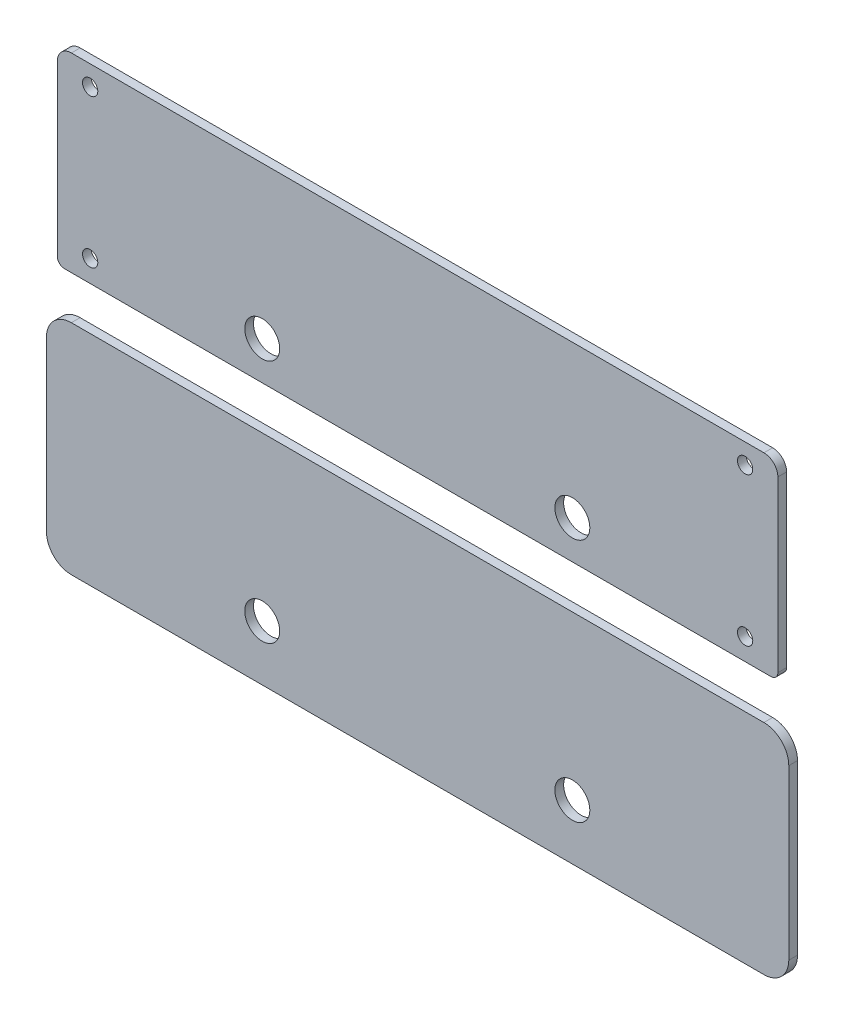
ISO-10303-21;
HEADER;
FILE_DESCRIPTION(('STEP AP214'),'2;1');
FILE_NAME('part.step','',(''),(''),'','','');
FILE_SCHEMA(('AUTOMOTIVE_DESIGN { 1 0 10303 214 1 1 1 1 }'));
ENDSEC;
DATA;
#1=APPLICATION_CONTEXT('core data for automotive mechanical design processes');
#2=APPLICATION_PROTOCOL_DEFINITION('international standard','automotive_design',2000,#1);
#3=PRODUCT_CONTEXT('',#1,'mechanical');
#4=PRODUCT('Part','Part','',(#3));
#5=PRODUCT_RELATED_PRODUCT_CATEGORY('part','',(#4));
#6=PRODUCT_DEFINITION_FORMATION('','',#4);
#7=PRODUCT_DEFINITION_CONTEXT('part definition',#1,'design');
#8=PRODUCT_DEFINITION('design','',#6,#7);
#9=PRODUCT_DEFINITION_SHAPE('','',#8);
#10=(LENGTH_UNIT() NAMED_UNIT(*) SI_UNIT(.MILLI.,.METRE.));
#11=(NAMED_UNIT(*) PLANE_ANGLE_UNIT() SI_UNIT($,.RADIAN.));
#12=(NAMED_UNIT(*) SI_UNIT($,.STERADIAN.) SOLID_ANGLE_UNIT());
#13=UNCERTAINTY_MEASURE_WITH_UNIT(LENGTH_MEASURE(1.E-05),#10,'distance_accuracy_value','');
#14=(GEOMETRIC_REPRESENTATION_CONTEXT(3) GLOBAL_UNCERTAINTY_ASSIGNED_CONTEXT((#13)) GLOBAL_UNIT_ASSIGNED_CONTEXT((#10,
#11,#12)) REPRESENTATION_CONTEXT('',''));
#15=CARTESIAN_POINT('',(0.,0.,0.));
#16=DIRECTION('',(0.,0.,1.));
#17=DIRECTION('',(1.,0.,0.));
#18=AXIS2_PLACEMENT_3D('',#15,#16,#17);
#19=CARTESIAN_POINT('',(100.711,95.631,2.54));
#20=DIRECTION('',(0.,0.,1.));
#21=DIRECTION('',(1.,0.,0.));
#22=AXIS2_PLACEMENT_3D('',#19,#20,#21);
#23=PLANE('',#22);
#24=CARTESIAN_POINT('',(-95.2500000000009,93.8699999999997,2.54));
#25=DIRECTION('',(0.,0.,1.));
#26=DIRECTION('',(1.,0.,0.));
#27=AXIS2_PLACEMENT_3D('',#24,#25,#26);
#28=CIRCLE('',#27,2.2225);
#29=CARTESIAN_POINT('',(-93.0275000000009,93.8699999999997,2.54));
#30=VERTEX_POINT('',#29);
#31=EDGE_CURVE('E217',#30,#30,#28,.T.);
#32=ORIENTED_EDGE('',*,*,#31,.F.);
#33=EDGE_LOOP('',(#32));
#34=FACE_BOUND('',#33,.T.);
#35=CARTESIAN_POINT('',(-95.2500000000009,50.6899999999997,2.54));
#36=DIRECTION('',(0.,0.,1.));
#37=DIRECTION('',(1.,0.,0.));
#38=AXIS2_PLACEMENT_3D('',#35,#36,#37);
#39=CIRCLE('',#38,2.2225);
#40=CARTESIAN_POINT('',(-93.0275000000009,50.6899999999997,2.54));
#41=VERTEX_POINT('',#40);
#42=EDGE_CURVE('E223',#41,#41,#39,.T.);
#43=ORIENTED_EDGE('',*,*,#42,.F.);
#44=EDGE_LOOP('',(#43));
#45=FACE_BOUND('',#44,.T.);
#46=CARTESIAN_POINT('',(95.2499999999991,50.6899999999997,2.54));
#47=DIRECTION('',(0.,0.,1.));
#48=DIRECTION('',(1.,0.,0.));
#49=AXIS2_PLACEMENT_3D('',#46,#47,#48);
#50=CIRCLE('',#49,2.2225);
#51=CARTESIAN_POINT('',(97.4724999999991,50.6899999999997,2.54));
#52=VERTEX_POINT('',#51);
#53=EDGE_CURVE('E229',#52,#52,#50,.T.);
#54=ORIENTED_EDGE('',*,*,#53,.F.);
#55=EDGE_LOOP('',(#54));
#56=FACE_BOUND('',#55,.T.);
#57=CARTESIAN_POINT('',(95.2499999999991,93.8699999999997,2.54));
#58=DIRECTION('',(0.,0.,1.));
#59=DIRECTION('',(1.,0.,0.));
#60=AXIS2_PLACEMENT_3D('',#57,#58,#59);
#61=CIRCLE('',#60,2.2225);
#62=CARTESIAN_POINT('',(97.4724999999991,93.8699999999997,2.54));
#63=VERTEX_POINT('',#62);
#64=EDGE_CURVE('E211',#63,#63,#61,.T.);
#65=ORIENTED_EDGE('',*,*,#64,.F.);
#66=EDGE_LOOP('',(#65));
#67=FACE_BOUND('',#66,.T.);
#68=CARTESIAN_POINT('',(-45.2000000000002,55.4698,2.54));
#69=DIRECTION('',(0.,0.,1.));
#70=DIRECTION('',(1.,0.,0.));
#71=AXIS2_PLACEMENT_3D('',#68,#69,#70);
#72=CIRCLE('',#71,5.08);
#73=CARTESIAN_POINT('',(-40.1200000000002,55.4698,2.54));
#74=VERTEX_POINT('',#73);
#75=EDGE_CURVE('E182',#74,#74,#72,.T.);
#76=ORIENTED_EDGE('',*,*,#75,.F.);
#77=EDGE_LOOP('',(#76));
#78=FACE_BOUND('',#77,.T.);
#79=DIRECTION('',(1.,0.,0.));
#80=VECTOR('',#79,1.);
#81=CARTESIAN_POINT('',(84.7749999999997,44.3450000000001,2.54));
#82=LINE('',#81,#80);
#83=CARTESIAN_POINT('',(-102.775,44.345,2.54));
#84=VERTEX_POINT('',#83);
#85=CARTESIAN_POINT('',(102.775,44.3450000000001,2.54));
#86=VERTEX_POINT('',#85);
#87=EDGE_CURVE('E171',#84,#86,#82,.T.);
#88=ORIENTED_EDGE('',*,*,#87,.T.);
#89=CARTESIAN_POINT('',(102.775,46.3450000000001,2.54));
#90=DIRECTION('',(0.,0.,1.));
#91=DIRECTION('',(1.,0.,0.));
#92=AXIS2_PLACEMENT_3D('',#89,#90,#91);
#93=CIRCLE('',#92,2.);
#94=CARTESIAN_POINT('',(104.775,46.3450000000001,2.54));
#95=VERTEX_POINT('',#94);
#96=EDGE_CURVE('E154',#86,#95,#93,.T.);
#97=ORIENTED_EDGE('',*,*,#96,.T.);
#98=DIRECTION('',(0.,1.,0.));
#99=VECTOR('',#98,1.);
#100=CARTESIAN_POINT('',(104.775,50.3450000000001,2.54));
#101=LINE('',#100,#99);
#102=CARTESIAN_POINT('',(104.775,95.631,2.54));
#103=VERTEX_POINT('',#102);
#104=EDGE_CURVE('E133',#95,#103,#101,.T.);
#105=ORIENTED_EDGE('',*,*,#104,.T.);
#106=CARTESIAN_POINT('',(100.711,95.631,2.54));
#107=DIRECTION('',(0.,0.,1.));
#108=DIRECTION('',(1.,0.,0.));
#109=AXIS2_PLACEMENT_3D('',#106,#107,#108);
#110=CIRCLE('',#109,4.064);
#111=CARTESIAN_POINT('',(100.711,99.695,2.54));
#112=VERTEX_POINT('',#111);
#113=EDGE_CURVE('E128',#103,#112,#110,.T.);
#114=ORIENTED_EDGE('',*,*,#113,.T.);
#115=DIRECTION('',(-1.,0.,0.));
#116=VECTOR('',#115,1.);
#117=CARTESIAN_POINT('',(100.711,99.695,2.54));
#118=LINE('',#117,#116);
#119=CARTESIAN_POINT('',(-100.711,99.695,2.54));
#120=VERTEX_POINT('',#119);
#121=EDGE_CURVE('E117',#112,#120,#118,.T.);
#122=ORIENTED_EDGE('',*,*,#121,.T.);
#123=CARTESIAN_POINT('',(-100.711,95.631,2.54));
#124=DIRECTION('',(0.,0.,1.));
#125=DIRECTION('',(1.,0.,0.));
#126=AXIS2_PLACEMENT_3D('',#123,#124,#125);
#127=CIRCLE('',#126,4.06399999999997);
#128=CARTESIAN_POINT('',(-104.775,95.631,2.54));
#129=VERTEX_POINT('',#128);
#130=EDGE_CURVE('E127',#120,#129,#127,.T.);
#131=ORIENTED_EDGE('',*,*,#130,.T.);
#132=DIRECTION('',(0.,-1.,0.));
#133=VECTOR('',#132,1.);
#134=CARTESIAN_POINT('',(-104.775,95.631,2.54));
#135=LINE('',#134,#133);
#136=CARTESIAN_POINT('',(-104.775,46.345,2.54));
#137=VERTEX_POINT('',#136);
#138=EDGE_CURVE('E176',#129,#137,#135,.T.);
#139=ORIENTED_EDGE('',*,*,#138,.T.);
#140=CARTESIAN_POINT('',(-102.775,46.345,2.54));
#141=DIRECTION('',(0.,0.,1.));
#142=DIRECTION('',(1.,0.,0.));
#143=AXIS2_PLACEMENT_3D('',#140,#141,#142);
#144=CIRCLE('',#143,2.);
#145=EDGE_CURVE('E152',#137,#84,#144,.T.);
#146=ORIENTED_EDGE('',*,*,#145,.T.);
#147=EDGE_LOOP('',(#88,#97,#105,#114,#122,#131,#139,#146));
#148=FACE_BOUND('',#147,.T.);
#149=CARTESIAN_POINT('',(44.9999999999998,55.4697999999989,2.54));
#150=DIRECTION('',(0.,0.,1.));
#151=DIRECTION('',(1.,0.,0.));
#152=AXIS2_PLACEMENT_3D('',#149,#150,#151);
#153=CIRCLE('',#152,5.08000000000001);
#154=CARTESIAN_POINT('',(50.0799999999998,55.4697999999989,2.54));
#155=VERTEX_POINT('',#154);
#156=EDGE_CURVE('E202',#155,#155,#153,.T.);
#157=ORIENTED_EDGE('',*,*,#156,.F.);
#158=EDGE_LOOP('',(#157));
#159=FACE_BOUND('',#158,.T.);
#160=ADVANCED_FACE('F49',(#34,#45,#56,#67,#78,#148,#159),#23,.T.);
#161=CARTESIAN_POINT('',(100.711,95.631,0.));
#162=DIRECTION('',(0.,0.,1.));
#163=DIRECTION('',(1.,0.,0.));
#164=AXIS2_PLACEMENT_3D('',#161,#162,#163);
#165=PLANE('',#164);
#166=CARTESIAN_POINT('',(-95.2500000000009,93.8699999999997,0.));
#167=DIRECTION('',(0.,0.,1.));
#168=DIRECTION('',(1.,0.,0.));
#169=AXIS2_PLACEMENT_3D('',#166,#167,#168);
#170=CIRCLE('',#169,2.2225);
#171=CARTESIAN_POINT('',(-93.0275000000009,93.8699999999997,0.));
#172=VERTEX_POINT('',#171);
#173=EDGE_CURVE('E220',#172,#172,#170,.T.);
#174=ORIENTED_EDGE('',*,*,#173,.T.);
#175=EDGE_LOOP('',(#174));
#176=FACE_BOUND('',#175,.T.);
#177=CARTESIAN_POINT('',(-95.2500000000009,50.6899999999997,0.));
#178=DIRECTION('',(0.,0.,1.));
#179=DIRECTION('',(1.,0.,0.));
#180=AXIS2_PLACEMENT_3D('',#177,#178,#179);
#181=CIRCLE('',#180,2.2225);
#182=CARTESIAN_POINT('',(-93.0275000000009,50.6899999999997,0.));
#183=VERTEX_POINT('',#182);
#184=EDGE_CURVE('E226',#183,#183,#181,.T.);
#185=ORIENTED_EDGE('',*,*,#184,.T.);
#186=EDGE_LOOP('',(#185));
#187=FACE_BOUND('',#186,.T.);
#188=CARTESIAN_POINT('',(95.2499999999991,50.6899999999997,0.));
#189=DIRECTION('',(0.,0.,1.));
#190=DIRECTION('',(1.,0.,0.));
#191=AXIS2_PLACEMENT_3D('',#188,#189,#190);
#192=CIRCLE('',#191,2.2225);
#193=CARTESIAN_POINT('',(97.4724999999991,50.6899999999997,0.));
#194=VERTEX_POINT('',#193);
#195=EDGE_CURVE('E214',#194,#194,#192,.T.);
#196=ORIENTED_EDGE('',*,*,#195,.T.);
#197=EDGE_LOOP('',(#196));
#198=FACE_BOUND('',#197,.T.);
#199=CARTESIAN_POINT('',(95.2499999999991,93.8699999999997,0.));
#200=DIRECTION('',(0.,0.,1.));
#201=DIRECTION('',(1.,0.,0.));
#202=AXIS2_PLACEMENT_3D('',#199,#200,#201);
#203=CIRCLE('',#202,2.2225);
#204=CARTESIAN_POINT('',(97.4724999999991,93.8699999999997,0.));
#205=VERTEX_POINT('',#204);
#206=EDGE_CURVE('E208',#205,#205,#203,.T.);
#207=ORIENTED_EDGE('',*,*,#206,.T.);
#208=EDGE_LOOP('',(#207));
#209=FACE_BOUND('',#208,.T.);
#210=DIRECTION('',(0.,1.,0.));
#211=VECTOR('',#210,1.);
#212=CARTESIAN_POINT('',(104.775,50.3450000000001,0.));
#213=LINE('',#212,#211);
#214=CARTESIAN_POINT('',(104.775,46.3450000000001,0.));
#215=VERTEX_POINT('',#214);
#216=CARTESIAN_POINT('',(104.775,95.631,0.));
#217=VERTEX_POINT('',#216);
#218=EDGE_CURVE('E137',#215,#217,#213,.T.);
#219=ORIENTED_EDGE('',*,*,#218,.F.);
#220=CARTESIAN_POINT('',(102.775,46.3450000000001,0.));
#221=DIRECTION('',(0.,0.,1.));
#222=DIRECTION('',(1.,0.,0.));
#223=AXIS2_PLACEMENT_3D('',#220,#221,#222);
#224=CIRCLE('',#223,2.);
#225=CARTESIAN_POINT('',(102.775,44.3450000000001,0.));
#226=VERTEX_POINT('',#225);
#227=EDGE_CURVE('E57',#215,#226,#224,.F.);
#228=ORIENTED_EDGE('',*,*,#227,.T.);
#229=DIRECTION('',(1.,0.,0.));
#230=VECTOR('',#229,1.);
#231=CARTESIAN_POINT('',(84.7749999999997,44.3450000000001,0.));
#232=LINE('',#231,#230);
#233=CARTESIAN_POINT('',(-102.775,44.345,0.));
#234=VERTEX_POINT('',#233);
#235=EDGE_CURVE('E161',#234,#226,#232,.T.);
#236=ORIENTED_EDGE('',*,*,#235,.F.);
#237=CARTESIAN_POINT('',(-102.775,46.345,0.));
#238=DIRECTION('',(0.,0.,1.));
#239=DIRECTION('',(1.,0.,0.));
#240=AXIS2_PLACEMENT_3D('',#237,#238,#239);
#241=CIRCLE('',#240,2.);
#242=CARTESIAN_POINT('',(-104.775,46.345,0.));
#243=VERTEX_POINT('',#242);
#244=EDGE_CURVE('E64',#234,#243,#241,.F.);
#245=ORIENTED_EDGE('',*,*,#244,.T.);
#246=DIRECTION('',(0.,-1.,0.));
#247=VECTOR('',#246,1.);
#248=CARTESIAN_POINT('',(-104.775,95.631,0.));
#249=LINE('',#248,#247);
#250=CARTESIAN_POINT('',(-104.775,95.631,0.));
#251=VERTEX_POINT('',#250);
#252=EDGE_CURVE('E168',#251,#243,#249,.T.);
#253=ORIENTED_EDGE('',*,*,#252,.F.);
#254=CARTESIAN_POINT('',(-100.711,95.631,0.));
#255=DIRECTION('',(0.,0.,1.));
#256=DIRECTION('',(1.,0.,0.));
#257=AXIS2_PLACEMENT_3D('',#254,#255,#256);
#258=CIRCLE('',#257,4.06399999999997);
#259=CARTESIAN_POINT('',(-100.711,99.695,0.));
#260=VERTEX_POINT('',#259);
#261=EDGE_CURVE('E184',#260,#251,#258,.T.);
#262=ORIENTED_EDGE('',*,*,#261,.F.);
#263=DIRECTION('',(-1.,0.,0.));
#264=VECTOR('',#263,1.);
#265=CARTESIAN_POINT('',(100.711,99.695,0.));
#266=LINE('',#265,#264);
#267=CARTESIAN_POINT('',(100.711,99.695,0.));
#268=VERTEX_POINT('',#267);
#269=EDGE_CURVE('E181',#268,#260,#266,.T.);
#270=ORIENTED_EDGE('',*,*,#269,.F.);
#271=CARTESIAN_POINT('',(100.711,95.631,0.));
#272=DIRECTION('',(0.,0.,1.));
#273=DIRECTION('',(1.,0.,0.));
#274=AXIS2_PLACEMENT_3D('',#271,#272,#273);
#275=CIRCLE('',#274,4.064);
#276=EDGE_CURVE('E141',#217,#268,#275,.T.);
#277=ORIENTED_EDGE('',*,*,#276,.F.);
#278=EDGE_LOOP('',(#219,#228,#236,#245,#253,#262,#270,#277));
#279=FACE_BOUND('',#278,.T.);
#280=CARTESIAN_POINT('',(-45.2000000000002,55.4698,0.));
#281=DIRECTION('',(0.,0.,1.));
#282=DIRECTION('',(1.,0.,0.));
#283=AXIS2_PLACEMENT_3D('',#280,#281,#282);
#284=CIRCLE('',#283,5.08);
#285=CARTESIAN_POINT('',(-40.1200000000002,55.4698,0.));
#286=VERTEX_POINT('',#285);
#287=EDGE_CURVE('E199',#286,#286,#284,.T.);
#288=ORIENTED_EDGE('',*,*,#287,.T.);
#289=EDGE_LOOP('',(#288));
#290=FACE_BOUND('',#289,.T.);
#291=CARTESIAN_POINT('',(44.9999999999998,55.4697999999989,0.));
#292=DIRECTION('',(0.,0.,1.));
#293=DIRECTION('',(1.,0.,0.));
#294=AXIS2_PLACEMENT_3D('',#291,#292,#293);
#295=CIRCLE('',#294,5.08000000000001);
#296=CARTESIAN_POINT('',(50.0799999999998,55.4697999999989,0.));
#297=VERTEX_POINT('',#296);
#298=EDGE_CURVE('E205',#297,#297,#295,.T.);
#299=ORIENTED_EDGE('',*,*,#298,.T.);
#300=EDGE_LOOP('',(#299));
#301=FACE_BOUND('',#300,.T.);
#302=ADVANCED_FACE('F159',(#176,#187,#198,#209,#279,#290,#301),#165,.F.);
#303=CARTESIAN_POINT('',(100.711,95.631,2.54));
#304=DIRECTION('',(0.,0.,-1.));
#305=DIRECTION('',(-1.,0.,0.));
#306=AXIS2_PLACEMENT_3D('',#303,#304,#305);
#307=CYLINDRICAL_SURFACE('',#306,4.064);
#308=ORIENTED_EDGE('',*,*,#276,.T.);
#309=DIRECTION('',(0.,0.,-1.));
#310=VECTOR('',#309,1.);
#311=CARTESIAN_POINT('',(100.711,99.695,2.54));
#312=LINE('',#311,#310);
#313=EDGE_CURVE('E121',#112,#268,#312,.T.);
#314=ORIENTED_EDGE('',*,*,#313,.F.);
#315=ORIENTED_EDGE('',*,*,#113,.F.);
#316=DIRECTION('',(0.,0.,-1.));
#317=VECTOR('',#316,1.);
#318=CARTESIAN_POINT('',(104.775,95.631,2.54));
#319=LINE('',#318,#317);
#320=EDGE_CURVE('E173',#103,#217,#319,.T.);
#321=ORIENTED_EDGE('',*,*,#320,.T.);
#322=EDGE_LOOP('',(#308,#314,#315,#321));
#323=FACE_BOUND('',#322,.T.);
#324=ADVANCED_FACE('F139',(#323),#307,.T.);
#325=CARTESIAN_POINT('',(100.711,99.695,2.54));
#326=DIRECTION('',(0.,-1.,0.));
#327=DIRECTION('',(0.,0.,-1.));
#328=AXIS2_PLACEMENT_3D('',#325,#326,#327);
#329=PLANE('',#328);
#330=ORIENTED_EDGE('',*,*,#269,.T.);
#331=DIRECTION('',(0.,0.,-1.));
#332=VECTOR('',#331,1.);
#333=CARTESIAN_POINT('',(-100.711,99.695,2.54));
#334=LINE('',#333,#332);
#335=EDGE_CURVE('E124',#120,#260,#334,.T.);
#336=ORIENTED_EDGE('',*,*,#335,.F.);
#337=ORIENTED_EDGE('',*,*,#121,.F.);
#338=ORIENTED_EDGE('',*,*,#313,.T.);
#339=EDGE_LOOP('',(#330,#336,#337,#338));
#340=FACE_BOUND('',#339,.T.);
#341=ADVANCED_FACE('F119',(#340),#329,.F.);
#342=CARTESIAN_POINT('',(-100.711,95.631,2.54));
#343=DIRECTION('',(0.,0.,-1.));
#344=DIRECTION('',(-1.,0.,0.));
#345=AXIS2_PLACEMENT_3D('',#342,#343,#344);
#346=CYLINDRICAL_SURFACE('',#345,4.06399999999997);
#347=ORIENTED_EDGE('',*,*,#261,.T.);
#348=DIRECTION('',(0.,0.,-1.));
#349=VECTOR('',#348,1.);
#350=CARTESIAN_POINT('',(-104.775,95.631,2.54));
#351=LINE('',#350,#349);
#352=EDGE_CURVE('E146',#129,#251,#351,.T.);
#353=ORIENTED_EDGE('',*,*,#352,.F.);
#354=ORIENTED_EDGE('',*,*,#130,.F.);
#355=ORIENTED_EDGE('',*,*,#335,.T.);
#356=EDGE_LOOP('',(#347,#353,#354,#355));
#357=FACE_BOUND('',#356,.T.);
#358=ADVANCED_FACE('F196',(#357),#346,.T.);
#359=CARTESIAN_POINT('',(-104.775,95.631,2.54));
#360=DIRECTION('',(1.,0.,0.));
#361=DIRECTION('',(0.,1.,0.));
#362=AXIS2_PLACEMENT_3D('',#359,#360,#361);
#363=PLANE('',#362);
#364=ORIENTED_EDGE('',*,*,#252,.T.);
#365=DIRECTION('',(0.,0.,1.));
#366=VECTOR('',#365,1.);
#367=CARTESIAN_POINT('',(-104.775,46.345,2.54));
#368=LINE('',#367,#366);
#369=EDGE_CURVE('E12',#243,#137,#368,.T.);
#370=ORIENTED_EDGE('',*,*,#369,.T.);
#371=ORIENTED_EDGE('',*,*,#138,.F.);
#372=ORIENTED_EDGE('',*,*,#352,.T.);
#373=EDGE_LOOP('',(#364,#370,#371,#372));
#374=FACE_BOUND('',#373,.T.);
#375=ADVANCED_FACE('F191',(#374),#363,.F.);
#376=CARTESIAN_POINT('',(84.7749999999997,44.3450000000001,2.54));
#377=DIRECTION('',(0.,1.,0.));
#378=DIRECTION('',(-1.,0.,0.));
#379=AXIS2_PLACEMENT_3D('',#376,#377,#378);
#380=PLANE('',#379);
#381=ORIENTED_EDGE('',*,*,#235,.T.);
#382=DIRECTION('',(0.,0.,1.));
#383=VECTOR('',#382,1.);
#384=CARTESIAN_POINT('',(102.775,44.3450000000001,2.54));
#385=LINE('',#384,#383);
#386=EDGE_CURVE('E144',#226,#86,#385,.T.);
#387=ORIENTED_EDGE('',*,*,#386,.T.);
#388=ORIENTED_EDGE('',*,*,#87,.F.);
#389=DIRECTION('',(0.,0.,1.));
#390=VECTOR('',#389,1.);
#391=CARTESIAN_POINT('',(-102.775,44.345,2.54));
#392=LINE('',#391,#390);
#393=EDGE_CURVE('E142',#84,#234,#392,.F.);
#394=ORIENTED_EDGE('',*,*,#393,.T.);
#395=EDGE_LOOP('',(#381,#387,#388,#394));
#396=FACE_BOUND('',#395,.T.);
#397=ADVANCED_FACE('F165',(#396),#380,.F.);
#398=CARTESIAN_POINT('',(104.775,50.3450000000001,2.54));
#399=DIRECTION('',(-1.,0.,0.));
#400=DIRECTION('',(0.,-1.,0.));
#401=AXIS2_PLACEMENT_3D('',#398,#399,#400);
#402=PLANE('',#401);
#403=ORIENTED_EDGE('',*,*,#104,.F.);
#404=DIRECTION('',(0.,0.,1.));
#405=VECTOR('',#404,1.);
#406=CARTESIAN_POINT('',(104.775,46.3450000000001,2.54));
#407=LINE('',#406,#405);
#408=EDGE_CURVE('E72',#95,#215,#407,.F.);
#409=ORIENTED_EDGE('',*,*,#408,.T.);
#410=ORIENTED_EDGE('',*,*,#218,.T.);
#411=ORIENTED_EDGE('',*,*,#320,.F.);
#412=EDGE_LOOP('',(#403,#409,#410,#411));
#413=FACE_BOUND('',#412,.T.);
#414=ADVANCED_FACE('F172',(#413),#402,.F.);
#415=CARTESIAN_POINT('',(-45.2000000000002,55.4698,2.54));
#416=DIRECTION('',(0.,0.,-1.));
#417=DIRECTION('',(-1.,0.,0.));
#418=AXIS2_PLACEMENT_3D('',#415,#416,#417);
#419=CYLINDRICAL_SURFACE('',#418,5.08);
#420=ORIENTED_EDGE('',*,*,#75,.T.);
#421=EDGE_LOOP('',(#420));
#422=FACE_BOUND('',#421,.T.);
#423=ORIENTED_EDGE('',*,*,#287,.F.);
#424=EDGE_LOOP('',(#423));
#425=FACE_BOUND('',#424,.T.);
#426=ADVANCED_FACE('F253',(#422,#425),#419,.F.);
#427=CARTESIAN_POINT('',(44.9999999999998,55.4697999999989,2.54));
#428=DIRECTION('',(0.,0.,-1.));
#429=DIRECTION('',(-1.,0.,0.));
#430=AXIS2_PLACEMENT_3D('',#427,#428,#429);
#431=CYLINDRICAL_SURFACE('',#430,5.08000000000001);
#432=ORIENTED_EDGE('',*,*,#156,.T.);
#433=EDGE_LOOP('',(#432));
#434=FACE_BOUND('',#433,.T.);
#435=ORIENTED_EDGE('',*,*,#298,.F.);
#436=EDGE_LOOP('',(#435));
#437=FACE_BOUND('',#436,.T.);
#438=ADVANCED_FACE('F256',(#434,#437),#431,.F.);
#439=CARTESIAN_POINT('',(102.775,46.3450000000001,2.54));
#440=DIRECTION('',(0.,0.,1.));
#441=DIRECTION('',(1.,0.,0.));
#442=AXIS2_PLACEMENT_3D('',#439,#440,#441);
#443=CYLINDRICAL_SURFACE('',#442,2.);
#444=ORIENTED_EDGE('',*,*,#227,.F.);
#445=ORIENTED_EDGE('',*,*,#408,.F.);
#446=ORIENTED_EDGE('',*,*,#96,.F.);
#447=ORIENTED_EDGE('',*,*,#386,.F.);
#448=EDGE_LOOP('',(#444,#445,#446,#447));
#449=FACE_BOUND('',#448,.T.);
#450=ADVANCED_FACE('F170',(#449),#443,.T.);
#451=CARTESIAN_POINT('',(-102.775,46.345,2.54));
#452=DIRECTION('',(0.,0.,1.));
#453=DIRECTION('',(1.,0.,0.));
#454=AXIS2_PLACEMENT_3D('',#451,#452,#453);
#455=CYLINDRICAL_SURFACE('',#454,2.);
#456=ORIENTED_EDGE('',*,*,#244,.F.);
#457=ORIENTED_EDGE('',*,*,#393,.F.);
#458=ORIENTED_EDGE('',*,*,#145,.F.);
#459=ORIENTED_EDGE('',*,*,#369,.F.);
#460=EDGE_LOOP('',(#456,#457,#458,#459));
#461=FACE_BOUND('',#460,.T.);
#462=ADVANCED_FACE('F51',(#461),#455,.T.);
#463=CARTESIAN_POINT('',(95.2499999999991,93.8699999999997,0.));
#464=DIRECTION('',(0.,0.,1.));
#465=DIRECTION('',(1.,0.,0.));
#466=AXIS2_PLACEMENT_3D('',#463,#464,#465);
#467=CYLINDRICAL_SURFACE('',#466,2.2225);
#468=ORIENTED_EDGE('',*,*,#206,.F.);
#469=EDGE_LOOP('',(#468));
#470=FACE_BOUND('',#469,.T.);
#471=ORIENTED_EDGE('',*,*,#64,.T.);
#472=EDGE_LOOP('',(#471));
#473=FACE_BOUND('',#472,.T.);
#474=ADVANCED_FACE('F241',(#470,#473),#467,.F.);
#475=CARTESIAN_POINT('',(95.2499999999991,50.6899999999997,0.));
#476=DIRECTION('',(0.,0.,1.));
#477=DIRECTION('',(1.,0.,0.));
#478=AXIS2_PLACEMENT_3D('',#475,#476,#477);
#479=CYLINDRICAL_SURFACE('',#478,2.2225);
#480=ORIENTED_EDGE('',*,*,#195,.F.);
#481=EDGE_LOOP('',(#480));
#482=FACE_BOUND('',#481,.T.);
#483=ORIENTED_EDGE('',*,*,#53,.T.);
#484=EDGE_LOOP('',(#483));
#485=FACE_BOUND('',#484,.T.);
#486=ADVANCED_FACE('F237',(#482,#485),#479,.F.);
#487=CARTESIAN_POINT('',(-95.2500000000009,50.6899999999997,0.));
#488=DIRECTION('',(0.,0.,1.));
#489=DIRECTION('',(1.,0.,0.));
#490=AXIS2_PLACEMENT_3D('',#487,#488,#489);
#491=CYLINDRICAL_SURFACE('',#490,2.2225);
#492=ORIENTED_EDGE('',*,*,#184,.F.);
#493=EDGE_LOOP('',(#492));
#494=FACE_BOUND('',#493,.T.);
#495=ORIENTED_EDGE('',*,*,#42,.T.);
#496=EDGE_LOOP('',(#495));
#497=FACE_BOUND('',#496,.T.);
#498=ADVANCED_FACE('F240',(#494,#497),#491,.F.);
#499=CARTESIAN_POINT('',(-95.2500000000009,93.8699999999997,0.));
#500=DIRECTION('',(0.,0.,1.));
#501=DIRECTION('',(1.,0.,0.));
#502=AXIS2_PLACEMENT_3D('',#499,#500,#501);
#503=CYLINDRICAL_SURFACE('',#502,2.2225);
#504=ORIENTED_EDGE('',*,*,#173,.F.);
#505=EDGE_LOOP('',(#504));
#506=FACE_BOUND('',#505,.T.);
#507=ORIENTED_EDGE('',*,*,#31,.T.);
#508=EDGE_LOOP('',(#507));
#509=FACE_BOUND('',#508,.T.);
#510=ADVANCED_FACE('F375',(#506,#509),#503,.F.);
#511=CLOSED_SHELL('',(#160,#302,#324,#341,#358,#375,#397,#414,#426,#438,#450,#462,#474,#486,
#498,#510));
#512=MANIFOLD_SOLID_BREP('B2',#511);
#513=CARTESIAN_POINT('',(-100.711,24.511,2.54));
#514=DIRECTION('',(0.,0.,1.));
#515=DIRECTION('',(1.,0.,0.));
#516=AXIS2_PLACEMENT_3D('',#513,#514,#515);
#517=PLANE('',#516);
#518=CARTESIAN_POINT('',(-45.2,-15.6502,2.54));
#519=DIRECTION('',(0.,0.,1.));
#520=DIRECTION('',(1.,0.,0.));
#521=AXIS2_PLACEMENT_3D('',#518,#519,#520);
#522=CIRCLE('',#521,5.08);
#523=CARTESIAN_POINT('',(-40.12,-15.6502,2.54));
#524=VERTEX_POINT('',#523);
#525=EDGE_CURVE('E533',#524,#524,#522,.T.);
#526=ORIENTED_EDGE('',*,*,#525,.F.);
#527=EDGE_LOOP('',(#526));
#528=FACE_BOUND('',#527,.T.);
#529=CARTESIAN_POINT('',(-100.711,24.511,2.54));
#530=DIRECTION('',(0.,0.,1.));
#531=DIRECTION('',(1.,0.,0.));
#532=AXIS2_PLACEMENT_3D('',#529,#530,#531);
#533=CIRCLE('',#532,7.23899999999997);
#534=CARTESIAN_POINT('',(-100.711,31.75,2.54));
#535=VERTEX_POINT('',#534);
#536=CARTESIAN_POINT('',(-107.95,24.511,2.54));
#537=VERTEX_POINT('',#536);
#538=EDGE_CURVE('E545',#535,#537,#533,.T.);
#539=ORIENTED_EDGE('',*,*,#538,.T.);
#540=DIRECTION('',(0.,-1.,0.));
#541=VECTOR('',#540,1.);
#542=CARTESIAN_POINT('',(-107.95,24.511,2.54));
#543=LINE('',#542,#541);
#544=CARTESIAN_POINT('',(-107.95,-24.511,2.54));
#545=VERTEX_POINT('',#544);
#546=EDGE_CURVE('E492',#537,#545,#543,.T.);
#547=ORIENTED_EDGE('',*,*,#546,.T.);
#548=CARTESIAN_POINT('',(-100.711,-24.511,2.54));
#549=DIRECTION('',(0.,0.,1.));
#550=DIRECTION('',(1.,0.,0.));
#551=AXIS2_PLACEMENT_3D('',#548,#549,#550);
#552=CIRCLE('',#551,7.23900000000001);
#553=CARTESIAN_POINT('',(-100.711,-31.75,2.54));
#554=VERTEX_POINT('',#553);
#555=EDGE_CURVE('E560',#545,#554,#552,.T.);
#556=ORIENTED_EDGE('',*,*,#555,.T.);
#557=DIRECTION('',(1.,0.,0.));
#558=VECTOR('',#557,1.);
#559=CARTESIAN_POINT('',(-100.711,-31.75,2.54));
#560=LINE('',#559,#558);
#561=CARTESIAN_POINT('',(100.711,-31.75,2.54));
#562=VERTEX_POINT('',#561);
#563=EDGE_CURVE('E572',#554,#562,#560,.T.);
#564=ORIENTED_EDGE('',*,*,#563,.T.);
#565=CARTESIAN_POINT('',(100.711,-24.511,2.54));
#566=DIRECTION('',(0.,0.,1.));
#567=DIRECTION('',(1.,0.,0.));
#568=AXIS2_PLACEMENT_3D('',#565,#566,#567);
#569=CIRCLE('',#568,7.23900000000001);
#570=CARTESIAN_POINT('',(107.95,-24.511,2.54));
#571=VERTEX_POINT('',#570);
#572=EDGE_CURVE('E511',#562,#571,#569,.T.);
#573=ORIENTED_EDGE('',*,*,#572,.T.);
#574=DIRECTION('',(0.,1.,0.));
#575=VECTOR('',#574,1.);
#576=CARTESIAN_POINT('',(107.95,-24.511,2.54));
#577=LINE('',#576,#575);
#578=CARTESIAN_POINT('',(107.95,24.511,2.54));
#579=VERTEX_POINT('',#578);
#580=EDGE_CURVE('E505',#571,#579,#577,.T.);
#581=ORIENTED_EDGE('',*,*,#580,.T.);
#582=CARTESIAN_POINT('',(100.711,24.511,2.54));
#583=DIRECTION('',(0.,0.,1.));
#584=DIRECTION('',(1.,0.,0.));
#585=AXIS2_PLACEMENT_3D('',#582,#583,#584);
#586=CIRCLE('',#585,7.23899999999999);
#587=CARTESIAN_POINT('',(100.711,31.75,2.54));
#588=VERTEX_POINT('',#587);
#589=EDGE_CURVE('E509',#579,#588,#586,.T.);
#590=ORIENTED_EDGE('',*,*,#589,.T.);
#591=DIRECTION('',(-1.,0.,0.));
#592=VECTOR('',#591,1.);
#593=CARTESIAN_POINT('',(100.711,31.75,2.54));
#594=LINE('',#593,#592);
#595=EDGE_CURVE('E449',#588,#535,#594,.T.);
#596=ORIENTED_EDGE('',*,*,#595,.T.);
#597=EDGE_LOOP('',(#539,#547,#556,#564,#573,#581,#590,#596));
#598=FACE_BOUND('',#597,.T.);
#599=CARTESIAN_POINT('',(45.,-15.6502000000011,2.54));
#600=DIRECTION('',(0.,0.,1.));
#601=DIRECTION('',(1.,0.,0.));
#602=AXIS2_PLACEMENT_3D('',#599,#600,#601);
#603=CIRCLE('',#602,5.08000000000001);
#604=CARTESIAN_POINT('',(50.08,-15.6502000000011,2.54));
#605=VERTEX_POINT('',#604);
#606=EDGE_CURVE('E581',#605,#605,#603,.T.);
#607=ORIENTED_EDGE('',*,*,#606,.F.);
#608=EDGE_LOOP('',(#607));
#609=FACE_BOUND('',#608,.T.);
#610=ADVANCED_FACE('F432',(#528,#598,#609),#517,.T.);
#611=CARTESIAN_POINT('',(-100.711,24.511,0.));
#612=DIRECTION('',(0.,0.,1.));
#613=DIRECTION('',(1.,0.,0.));
#614=AXIS2_PLACEMENT_3D('',#611,#612,#613);
#615=PLANE('',#614);
#616=CARTESIAN_POINT('',(-100.711,24.511,0.));
#617=DIRECTION('',(0.,0.,1.));
#618=DIRECTION('',(1.,0.,0.));
#619=AXIS2_PLACEMENT_3D('',#616,#617,#618);
#620=CIRCLE('',#619,7.23899999999997);
#621=CARTESIAN_POINT('',(-100.711,31.75,0.));
#622=VERTEX_POINT('',#621);
#623=CARTESIAN_POINT('',(-107.95,24.511,0.));
#624=VERTEX_POINT('',#623);
#625=EDGE_CURVE('E529',#622,#624,#620,.T.);
#626=ORIENTED_EDGE('',*,*,#625,.F.);
#627=DIRECTION('',(-1.,0.,0.));
#628=VECTOR('',#627,1.);
#629=CARTESIAN_POINT('',(100.711,31.75,0.));
#630=LINE('',#629,#628);
#631=CARTESIAN_POINT('',(100.711,31.75,0.));
#632=VERTEX_POINT('',#631);
#633=EDGE_CURVE('E484',#632,#622,#630,.T.);
#634=ORIENTED_EDGE('',*,*,#633,.F.);
#635=CARTESIAN_POINT('',(100.711,24.511,0.));
#636=DIRECTION('',(0.,0.,1.));
#637=DIRECTION('',(1.,0.,0.));
#638=AXIS2_PLACEMENT_3D('',#635,#636,#637);
#639=CIRCLE('',#638,7.23899999999999);
#640=CARTESIAN_POINT('',(107.95,24.511,0.));
#641=VERTEX_POINT('',#640);
#642=EDGE_CURVE('E478',#641,#632,#639,.T.);
#643=ORIENTED_EDGE('',*,*,#642,.F.);
#644=DIRECTION('',(0.,1.,0.));
#645=VECTOR('',#644,1.);
#646=CARTESIAN_POINT('',(107.95,-24.511,0.));
#647=LINE('',#646,#645);
#648=CARTESIAN_POINT('',(107.95,-24.511,0.));
#649=VERTEX_POINT('',#648);
#650=EDGE_CURVE('E519',#649,#641,#647,.T.);
#651=ORIENTED_EDGE('',*,*,#650,.F.);
#652=CARTESIAN_POINT('',(100.711,-24.511,0.));
#653=DIRECTION('',(0.,0.,1.));
#654=DIRECTION('',(1.,0.,0.));
#655=AXIS2_PLACEMENT_3D('',#652,#653,#654);
#656=CIRCLE('',#655,7.23900000000001);
#657=CARTESIAN_POINT('',(100.711,-31.75,0.));
#658=VERTEX_POINT('',#657);
#659=EDGE_CURVE('E540',#658,#649,#656,.T.);
#660=ORIENTED_EDGE('',*,*,#659,.F.);
#661=DIRECTION('',(1.,0.,0.));
#662=VECTOR('',#661,1.);
#663=CARTESIAN_POINT('',(52.4295,-31.75,0.));
#664=LINE('',#663,#662);
#665=CARTESIAN_POINT('',(-100.711,-31.75,0.));
#666=VERTEX_POINT('',#665);
#667=EDGE_CURVE('E538',#666,#658,#664,.T.);
#668=ORIENTED_EDGE('',*,*,#667,.F.);
#669=CARTESIAN_POINT('',(-100.711,-24.511,0.));
#670=DIRECTION('',(0.,0.,1.));
#671=DIRECTION('',(1.,0.,0.));
#672=AXIS2_PLACEMENT_3D('',#669,#670,#671);
#673=CIRCLE('',#672,7.23900000000001);
#674=CARTESIAN_POINT('',(-107.95,-24.511,0.));
#675=VERTEX_POINT('',#674);
#676=EDGE_CURVE('E535',#675,#666,#673,.T.);
#677=ORIENTED_EDGE('',*,*,#676,.F.);
#678=DIRECTION('',(0.,-1.,0.));
#679=VECTOR('',#678,1.);
#680=CARTESIAN_POINT('',(-107.95,24.511,0.));
#681=LINE('',#680,#679);
#682=EDGE_CURVE('E532',#624,#675,#681,.T.);
#683=ORIENTED_EDGE('',*,*,#682,.F.);
#684=EDGE_LOOP('',(#626,#634,#643,#651,#660,#668,#677,#683));
#685=FACE_BOUND('',#684,.T.);
#686=CARTESIAN_POINT('',(-45.2,-15.6502,0.));
#687=DIRECTION('',(0.,0.,1.));
#688=DIRECTION('',(1.,0.,0.));
#689=AXIS2_PLACEMENT_3D('',#686,#687,#688);
#690=CIRCLE('',#689,5.08);
#691=CARTESIAN_POINT('',(-40.12,-15.6502,0.));
#692=VERTEX_POINT('',#691);
#693=EDGE_CURVE('E578',#692,#692,#690,.T.);
#694=ORIENTED_EDGE('',*,*,#693,.T.);
#695=EDGE_LOOP('',(#694));
#696=FACE_BOUND('',#695,.T.);
#697=CARTESIAN_POINT('',(45.,-15.6502000000011,0.));
#698=DIRECTION('',(0.,0.,1.));
#699=DIRECTION('',(1.,0.,0.));
#700=AXIS2_PLACEMENT_3D('',#697,#698,#699);
#701=CIRCLE('',#700,5.08000000000001);
#702=CARTESIAN_POINT('',(50.08,-15.6502000000011,0.));
#703=VERTEX_POINT('',#702);
#704=EDGE_CURVE('E584',#703,#703,#701,.T.);
#705=ORIENTED_EDGE('',*,*,#704,.T.);
#706=EDGE_LOOP('',(#705));
#707=FACE_BOUND('',#706,.T.);
#708=ADVANCED_FACE('F563',(#685,#696,#707),#615,.F.);
#709=CARTESIAN_POINT('',(-100.711,24.511,2.54));
#710=DIRECTION('',(0.,0.,-1.));
#711=DIRECTION('',(-1.,0.,0.));
#712=AXIS2_PLACEMENT_3D('',#709,#710,#711);
#713=CYLINDRICAL_SURFACE('',#712,7.23899999999997);
#714=ORIENTED_EDGE('',*,*,#625,.T.);
#715=DIRECTION('',(0.,0.,-1.));
#716=VECTOR('',#715,1.);
#717=CARTESIAN_POINT('',(-107.95,24.511,2.54));
#718=LINE('',#717,#716);
#719=EDGE_CURVE('E47',#537,#624,#718,.T.);
#720=ORIENTED_EDGE('',*,*,#719,.F.);
#721=ORIENTED_EDGE('',*,*,#538,.F.);
#722=DIRECTION('',(0.,0.,-1.));
#723=VECTOR('',#722,1.);
#724=CARTESIAN_POINT('',(-100.711,31.75,2.54));
#725=LINE('',#724,#723);
#726=EDGE_CURVE('E525',#535,#622,#725,.T.);
#727=ORIENTED_EDGE('',*,*,#726,.T.);
#728=EDGE_LOOP('',(#714,#720,#721,#727));
#729=FACE_BOUND('',#728,.T.);
#730=ADVANCED_FACE('F434',(#729),#713,.T.);
#731=CARTESIAN_POINT('',(-107.95,24.511,2.54));
#732=DIRECTION('',(1.,0.,0.));
#733=DIRECTION('',(0.,1.,0.));
#734=AXIS2_PLACEMENT_3D('',#731,#732,#733);
#735=PLANE('',#734);
#736=ORIENTED_EDGE('',*,*,#682,.T.);
#737=DIRECTION('',(0.,0.,-1.));
#738=VECTOR('',#737,1.);
#739=CARTESIAN_POINT('',(-107.95,-24.511,2.54));
#740=LINE('',#739,#738);
#741=EDGE_CURVE('E441',#545,#675,#740,.T.);
#742=ORIENTED_EDGE('',*,*,#741,.F.);
#743=ORIENTED_EDGE('',*,*,#546,.F.);
#744=ORIENTED_EDGE('',*,*,#719,.T.);
#745=EDGE_LOOP('',(#736,#742,#743,#744));
#746=FACE_BOUND('',#745,.T.);
#747=ADVANCED_FACE('F616',(#746),#735,.F.);
#748=CARTESIAN_POINT('',(-100.711,-24.511,2.54));
#749=DIRECTION('',(0.,0.,-1.));
#750=DIRECTION('',(-1.,0.,0.));
#751=AXIS2_PLACEMENT_3D('',#748,#749,#750);
#752=CYLINDRICAL_SURFACE('',#751,7.23900000000001);
#753=ORIENTED_EDGE('',*,*,#676,.T.);
#754=DIRECTION('',(0.,0.,-1.));
#755=VECTOR('',#754,1.);
#756=CARTESIAN_POINT('',(-100.711,-31.75,2.54));
#757=LINE('',#756,#755);
#758=EDGE_CURVE('E552',#554,#666,#757,.T.);
#759=ORIENTED_EDGE('',*,*,#758,.F.);
#760=ORIENTED_EDGE('',*,*,#555,.F.);
#761=ORIENTED_EDGE('',*,*,#741,.T.);
#762=EDGE_LOOP('',(#753,#759,#760,#761));
#763=FACE_BOUND('',#762,.T.);
#764=ADVANCED_FACE('F558',(#763),#752,.T.);
#765=CARTESIAN_POINT('',(52.4295,-31.75,2.54));
#766=DIRECTION('',(0.,1.,0.));
#767=DIRECTION('',(0.,0.,1.));
#768=AXIS2_PLACEMENT_3D('',#765,#766,#767);
#769=PLANE('',#768);
#770=ORIENTED_EDGE('',*,*,#667,.T.);
#771=DIRECTION('',(0.,0.,-1.));
#772=VECTOR('',#771,1.);
#773=CARTESIAN_POINT('',(100.711,-31.75,2.54));
#774=LINE('',#773,#772);
#775=EDGE_CURVE('E549',#562,#658,#774,.T.);
#776=ORIENTED_EDGE('',*,*,#775,.F.);
#777=ORIENTED_EDGE('',*,*,#563,.F.);
#778=ORIENTED_EDGE('',*,*,#758,.T.);
#779=EDGE_LOOP('',(#770,#776,#777,#778));
#780=FACE_BOUND('',#779,.T.);
#781=ADVANCED_FACE('F568',(#780),#769,.F.);
#782=CARTESIAN_POINT('',(100.711,-24.511,2.54));
#783=DIRECTION('',(0.,0.,-1.));
#784=DIRECTION('',(-1.,0.,0.));
#785=AXIS2_PLACEMENT_3D('',#782,#783,#784);
#786=CYLINDRICAL_SURFACE('',#785,7.23900000000001);
#787=ORIENTED_EDGE('',*,*,#659,.T.);
#788=DIRECTION('',(0.,0.,-1.));
#789=VECTOR('',#788,1.);
#790=CARTESIAN_POINT('',(107.95,-24.511,2.54));
#791=LINE('',#790,#789);
#792=EDGE_CURVE('E520',#571,#649,#791,.T.);
#793=ORIENTED_EDGE('',*,*,#792,.F.);
#794=ORIENTED_EDGE('',*,*,#572,.F.);
#795=ORIENTED_EDGE('',*,*,#775,.T.);
#796=EDGE_LOOP('',(#787,#793,#794,#795));
#797=FACE_BOUND('',#796,.T.);
#798=ADVANCED_FACE('F571',(#797),#786,.T.);
#799=CARTESIAN_POINT('',(107.95,-24.511,2.54));
#800=DIRECTION('',(-1.,0.,0.));
#801=DIRECTION('',(0.,0.,1.));
#802=AXIS2_PLACEMENT_3D('',#799,#800,#801);
#803=PLANE('',#802);
#804=ORIENTED_EDGE('',*,*,#650,.T.);
#805=DIRECTION('',(0.,0.,-1.));
#806=VECTOR('',#805,1.);
#807=CARTESIAN_POINT('',(107.95,24.511,2.54));
#808=LINE('',#807,#806);
#809=EDGE_CURVE('E516',#579,#641,#808,.T.);
#810=ORIENTED_EDGE('',*,*,#809,.F.);
#811=ORIENTED_EDGE('',*,*,#580,.F.);
#812=ORIENTED_EDGE('',*,*,#792,.T.);
#813=EDGE_LOOP('',(#804,#810,#811,#812));
#814=FACE_BOUND('',#813,.T.);
#815=ADVANCED_FACE('F517',(#814),#803,.F.);
#816=CARTESIAN_POINT('',(100.711,24.511,2.54));
#817=DIRECTION('',(0.,0.,-1.));
#818=DIRECTION('',(-1.,0.,0.));
#819=AXIS2_PLACEMENT_3D('',#816,#817,#818);
#820=CYLINDRICAL_SURFACE('',#819,7.23899999999999);
#821=ORIENTED_EDGE('',*,*,#642,.T.);
#822=DIRECTION('',(0.,0.,-1.));
#823=VECTOR('',#822,1.);
#824=CARTESIAN_POINT('',(100.711,31.75,2.54));
#825=LINE('',#824,#823);
#826=EDGE_CURVE('E521',#588,#632,#825,.T.);
#827=ORIENTED_EDGE('',*,*,#826,.F.);
#828=ORIENTED_EDGE('',*,*,#589,.F.);
#829=ORIENTED_EDGE('',*,*,#809,.T.);
#830=EDGE_LOOP('',(#821,#827,#828,#829));
#831=FACE_BOUND('',#830,.T.);
#832=ADVANCED_FACE('F523',(#831),#820,.T.);
#833=CARTESIAN_POINT('',(100.711,31.75,2.54));
#834=DIRECTION('',(0.,-1.,0.));
#835=DIRECTION('',(1.,0.,0.));
#836=AXIS2_PLACEMENT_3D('',#833,#834,#835);
#837=PLANE('',#836);
#838=ORIENTED_EDGE('',*,*,#633,.T.);
#839=ORIENTED_EDGE('',*,*,#726,.F.);
#840=ORIENTED_EDGE('',*,*,#595,.F.);
#841=ORIENTED_EDGE('',*,*,#826,.T.);
#842=EDGE_LOOP('',(#838,#839,#840,#841));
#843=FACE_BOUND('',#842,.T.);
#844=ADVANCED_FACE('F604',(#843),#837,.F.);
#845=CARTESIAN_POINT('',(-45.2,-15.6502,2.54));
#846=DIRECTION('',(0.,0.,-1.));
#847=DIRECTION('',(-1.,0.,0.));
#848=AXIS2_PLACEMENT_3D('',#845,#846,#847);
#849=CYLINDRICAL_SURFACE('',#848,5.08);
#850=ORIENTED_EDGE('',*,*,#525,.T.);
#851=EDGE_LOOP('',(#850));
#852=FACE_BOUND('',#851,.T.);
#853=ORIENTED_EDGE('',*,*,#693,.F.);
#854=EDGE_LOOP('',(#853));
#855=FACE_BOUND('',#854,.T.);
#856=ADVANCED_FACE('F601',(#852,#855),#849,.F.);
#857=CARTESIAN_POINT('',(45.,-15.6502000000011,2.54));
#858=DIRECTION('',(0.,0.,-1.));
#859=DIRECTION('',(-1.,0.,0.));
#860=AXIS2_PLACEMENT_3D('',#857,#858,#859);
#861=CYLINDRICAL_SURFACE('',#860,5.08000000000001);
#862=ORIENTED_EDGE('',*,*,#606,.T.);
#863=EDGE_LOOP('',(#862));
#864=FACE_BOUND('',#863,.T.);
#865=ORIENTED_EDGE('',*,*,#704,.F.);
#866=EDGE_LOOP('',(#865));
#867=FACE_BOUND('',#866,.T.);
#868=ADVANCED_FACE('F590',(#864,#867),#861,.F.);
#869=CLOSED_SHELL('',(#610,#708,#730,#747,#764,#781,#798,#815,#832,#844,#856,#868));
#870=MANIFOLD_SOLID_BREP('B6_NOT_SHOWN',#869);
#871=ADVANCED_BREP_SHAPE_REPRESENTATION('',(#18,#512,#870),#14);
#872=SHAPE_DEFINITION_REPRESENTATION(#9,#871);
ENDSEC;
END-ISO-10303-21;
